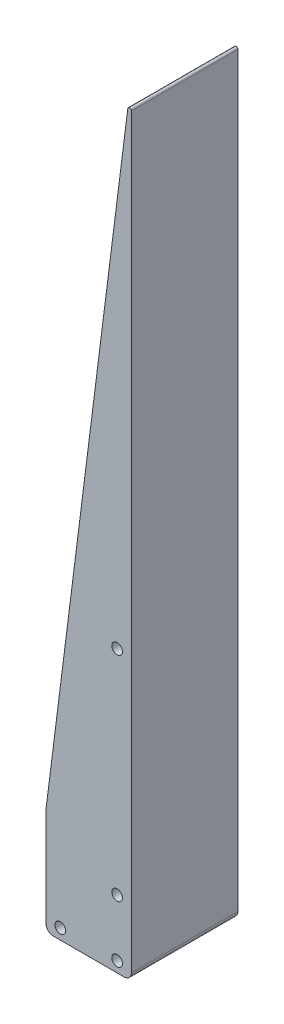
ISO-10303-21;
HEADER;
FILE_DESCRIPTION(('STEP AP214'),'2;1');
FILE_NAME('part.step','',(''),(''),'','','');
FILE_SCHEMA(('AUTOMOTIVE_DESIGN { 1 0 10303 214 1 1 1 1 }'));
ENDSEC;
DATA;
#1=APPLICATION_CONTEXT('core data for automotive mechanical design processes');
#2=APPLICATION_PROTOCOL_DEFINITION('international standard','automotive_design',2000,#1);
#3=PRODUCT_CONTEXT('',#1,'mechanical');
#4=PRODUCT('Part','Part','',(#3));
#5=PRODUCT_RELATED_PRODUCT_CATEGORY('part','',(#4));
#6=PRODUCT_DEFINITION_FORMATION('','',#4);
#7=PRODUCT_DEFINITION_CONTEXT('part definition',#1,'design');
#8=PRODUCT_DEFINITION('design','',#6,#7);
#9=PRODUCT_DEFINITION_SHAPE('','',#8);
#10=(LENGTH_UNIT() NAMED_UNIT(*) SI_UNIT(.MILLI.,.METRE.));
#11=(NAMED_UNIT(*) PLANE_ANGLE_UNIT() SI_UNIT($,.RADIAN.));
#12=(NAMED_UNIT(*) SI_UNIT($,.STERADIAN.) SOLID_ANGLE_UNIT());
#13=UNCERTAINTY_MEASURE_WITH_UNIT(LENGTH_MEASURE(1.E-05),#10,'distance_accuracy_value','');
#14=(GEOMETRIC_REPRESENTATION_CONTEXT(3) GLOBAL_UNCERTAINTY_ASSIGNED_CONTEXT((#13)) GLOBAL_UNIT_ASSIGNED_CONTEXT((#10,
#11,#12)) REPRESENTATION_CONTEXT('',''));
#15=CARTESIAN_POINT('',(0.,0.,0.));
#16=DIRECTION('',(0.,0.,1.));
#17=DIRECTION('',(1.,0.,0.));
#18=AXIS2_PLACEMENT_3D('',#15,#16,#17);
#19=CARTESIAN_POINT('',(23.5,212.051879356824,30.));
#20=DIRECTION('',(0.,0.,1.));
#21=DIRECTION('',(1.,0.,0.));
#22=AXIS2_PLACEMENT_3D('',#19,#20,#21);
#23=PLANE('',#22);
#24=CARTESIAN_POINT('',(19.9999999999995,79.0000000000001,30.));
#25=DIRECTION('',(0.,0.,-1.));
#26=DIRECTION('',(-1.,0.,0.));
#27=AXIS2_PLACEMENT_3D('',#24,#25,#26);
#28=CIRCLE('',#27,1.5);
#29=CARTESIAN_POINT('',(18.4999999999994,79.0000000000001,30.));
#30=VERTEX_POINT('',#29);
#31=EDGE_CURVE('E205',#30,#30,#28,.T.);
#32=ORIENTED_EDGE('',*,*,#31,.T.);
#33=EDGE_LOOP('',(#32));
#34=FACE_BOUND('',#33,.T.);
#35=CARTESIAN_POINT('',(4.,2.99999999999989,30.));
#36=DIRECTION('',(0.,0.,1.));
#37=DIRECTION('',(1.,0.,0.));
#38=AXIS2_PLACEMENT_3D('',#35,#36,#37);
#39=CIRCLE('',#38,1.5);
#40=CARTESIAN_POINT('',(5.5,2.99999999999989,30.));
#41=VERTEX_POINT('',#40);
#42=EDGE_CURVE('E186',#41,#41,#39,.T.);
#43=ORIENTED_EDGE('',*,*,#42,.F.);
#44=EDGE_LOOP('',(#43));
#45=FACE_BOUND('',#44,.T.);
#46=CARTESIAN_POINT('',(23.5,212.051879356824,30.));
#47=DIRECTION('',(0.,0.,1.));
#48=DIRECTION('',(1.,0.,0.));
#49=AXIS2_PLACEMENT_3D('',#46,#47,#48);
#50=CIRCLE('',#49,0.5);
#51=CARTESIAN_POINT('',(24.,212.051879356824,30.));
#52=VERTEX_POINT('',#51);
#53=CARTESIAN_POINT('',(23.0039418111876,212.114539338569,30.));
#54=VERTEX_POINT('',#53);
#55=EDGE_CURVE('E153',#52,#54,#50,.T.);
#56=ORIENTED_EDGE('',*,*,#55,.T.);
#57=DIRECTION('',(-0.125319963489427,-0.992116377624626,0.));
#58=VECTOR('',#57,1.);
#59=CARTESIAN_POINT('',(23.0039418111876,212.114539338569,30.));
#60=LINE('',#59,#58);
#61=CARTESIAN_POINT('',(0.0157672447507946,30.1248240209441,30.));
#62=VERTEX_POINT('',#61);
#63=EDGE_CURVE('E101',#54,#62,#60,.T.);
#64=ORIENTED_EDGE('',*,*,#63,.T.);
#65=CARTESIAN_POINT('',(2.00000000000004,29.8741840939652,30.));
#66=DIRECTION('',(0.,0.,1.));
#67=DIRECTION('',(-1.,0.,0.));
#68=AXIS2_PLACEMENT_3D('',#65,#66,#67);
#69=CIRCLE('',#68,2.);
#70=CARTESIAN_POINT('',(0.,29.8741840939652,30.));
#71=VERTEX_POINT('',#70);
#72=EDGE_CURVE('E169',#62,#71,#69,.T.);
#73=ORIENTED_EDGE('',*,*,#72,.T.);
#74=DIRECTION('',(0.,-1.,0.));
#75=VECTOR('',#74,1.);
#76=CARTESIAN_POINT('',(0.,2.00000000000002,30.));
#77=LINE('',#76,#75);
#78=CARTESIAN_POINT('',(0.,2.,30.));
#79=VERTEX_POINT('',#78);
#80=EDGE_CURVE('E182',#71,#79,#77,.T.);
#81=ORIENTED_EDGE('',*,*,#80,.T.);
#82=CARTESIAN_POINT('',(2.,2.,30.));
#83=DIRECTION('',(0.,0.,1.));
#84=DIRECTION('',(-1.,0.,0.));
#85=AXIS2_PLACEMENT_3D('',#82,#83,#84);
#86=CIRCLE('',#85,2.);
#87=CARTESIAN_POINT('',(2.00000000000002,0.,30.));
#88=VERTEX_POINT('',#87);
#89=EDGE_CURVE('E116',#79,#88,#86,.T.);
#90=ORIENTED_EDGE('',*,*,#89,.T.);
#91=DIRECTION('',(1.,0.,0.));
#92=VECTOR('',#91,1.);
#93=CARTESIAN_POINT('',(2.00000000000002,0.,30.));
#94=LINE('',#93,#92);
#95=CARTESIAN_POINT('',(22.,0.,30.));
#96=VERTEX_POINT('',#95);
#97=EDGE_CURVE('E111',#88,#96,#94,.T.);
#98=ORIENTED_EDGE('',*,*,#97,.T.);
#99=CARTESIAN_POINT('',(22.,2.,30.));
#100=DIRECTION('',(0.,0.,1.));
#101=DIRECTION('',(-1.,0.,0.));
#102=AXIS2_PLACEMENT_3D('',#99,#100,#101);
#103=CIRCLE('',#102,2.);
#104=CARTESIAN_POINT('',(24.,2.00000000000001,30.));
#105=VERTEX_POINT('',#104);
#106=EDGE_CURVE('E117',#96,#105,#103,.T.);
#107=ORIENTED_EDGE('',*,*,#106,.T.);
#108=DIRECTION('',(0.,1.,0.));
#109=VECTOR('',#108,1.);
#110=CARTESIAN_POINT('',(24.,2.00000000000001,30.));
#111=LINE('',#110,#109);
#112=EDGE_CURVE('E59',#105,#52,#111,.T.);
#113=ORIENTED_EDGE('',*,*,#112,.T.);
#114=EDGE_LOOP('',(#56,#64,#73,#81,#90,#98,#107,#113));
#115=FACE_BOUND('',#114,.T.);
#116=CARTESIAN_POINT('',(20.,3.,30.));
#117=DIRECTION('',(0.,0.,1.));
#118=DIRECTION('',(1.,0.,0.));
#119=AXIS2_PLACEMENT_3D('',#116,#117,#118);
#120=CIRCLE('',#119,1.5);
#121=CARTESIAN_POINT('',(21.5,3.,30.));
#122=VERTEX_POINT('',#121);
#123=EDGE_CURVE('E142',#122,#122,#120,.T.);
#124=ORIENTED_EDGE('',*,*,#123,.F.);
#125=EDGE_LOOP('',(#124));
#126=FACE_BOUND('',#125,.T.);
#127=CARTESIAN_POINT('',(19.9999999999999,19.,30.));
#128=DIRECTION('',(0.,0.,1.));
#129=DIRECTION('',(1.,0.,0.));
#130=AXIS2_PLACEMENT_3D('',#127,#128,#129);
#131=CIRCLE('',#130,1.5);
#132=CARTESIAN_POINT('',(21.4999999999999,19.,30.));
#133=VERTEX_POINT('',#132);
#134=EDGE_CURVE('E198',#133,#133,#131,.T.);
#135=ORIENTED_EDGE('',*,*,#134,.F.);
#136=EDGE_LOOP('',(#135));
#137=FACE_BOUND('',#136,.T.);
#138=ADVANCED_FACE('F41',(#34,#45,#115,#126,#137),#23,.T.);
#139=CARTESIAN_POINT('',(23.5,212.051879356824,0.));
#140=DIRECTION('',(0.,0.,1.));
#141=DIRECTION('',(1.,0.,0.));
#142=AXIS2_PLACEMENT_3D('',#139,#140,#141);
#143=PLANE('',#142);
#144=CARTESIAN_POINT('',(19.9999999999995,79.0000000000001,0.));
#145=DIRECTION('',(0.,0.,-1.));
#146=DIRECTION('',(-1.,0.,0.));
#147=AXIS2_PLACEMENT_3D('',#144,#145,#146);
#148=CIRCLE('',#147,1.5);
#149=CARTESIAN_POINT('',(18.4999999999994,79.0000000000001,0.));
#150=VERTEX_POINT('',#149);
#151=EDGE_CURVE('E202',#150,#150,#148,.T.);
#152=ORIENTED_EDGE('',*,*,#151,.F.);
#153=EDGE_LOOP('',(#152));
#154=FACE_BOUND('',#153,.T.);
#155=CARTESIAN_POINT('',(23.5,212.051879356824,0.));
#156=DIRECTION('',(0.,0.,1.));
#157=DIRECTION('',(1.,0.,0.));
#158=AXIS2_PLACEMENT_3D('',#155,#156,#157);
#159=CIRCLE('',#158,0.5);
#160=CARTESIAN_POINT('',(24.,212.051879356824,0.));
#161=VERTEX_POINT('',#160);
#162=CARTESIAN_POINT('',(23.0039418111876,212.114539338569,0.));
#163=VERTEX_POINT('',#162);
#164=EDGE_CURVE('E137',#161,#163,#159,.T.);
#165=ORIENTED_EDGE('',*,*,#164,.F.);
#166=DIRECTION('',(0.,1.,0.));
#167=VECTOR('',#166,1.);
#168=CARTESIAN_POINT('',(24.,2.00000000000001,0.));
#169=LINE('',#168,#167);
#170=CARTESIAN_POINT('',(24.,2.00000000000001,0.));
#171=VERTEX_POINT('',#170);
#172=EDGE_CURVE('E91',#171,#161,#169,.T.);
#173=ORIENTED_EDGE('',*,*,#172,.F.);
#174=CARTESIAN_POINT('',(22.,2.,0.));
#175=DIRECTION('',(0.,0.,1.));
#176=DIRECTION('',(-1.,0.,0.));
#177=AXIS2_PLACEMENT_3D('',#174,#175,#176);
#178=CIRCLE('',#177,2.);
#179=CARTESIAN_POINT('',(22.,0.,0.));
#180=VERTEX_POINT('',#179);
#181=EDGE_CURVE('E87',#180,#171,#178,.T.);
#182=ORIENTED_EDGE('',*,*,#181,.F.);
#183=DIRECTION('',(1.,0.,0.));
#184=VECTOR('',#183,1.);
#185=CARTESIAN_POINT('',(2.00000000000002,0.,0.));
#186=LINE('',#185,#184);
#187=CARTESIAN_POINT('',(2.00000000000002,0.,0.));
#188=VERTEX_POINT('',#187);
#189=EDGE_CURVE('E126',#188,#180,#186,.T.);
#190=ORIENTED_EDGE('',*,*,#189,.F.);
#191=CARTESIAN_POINT('',(2.,2.,0.));
#192=DIRECTION('',(0.,0.,1.));
#193=DIRECTION('',(-1.,0.,0.));
#194=AXIS2_PLACEMENT_3D('',#191,#192,#193);
#195=CIRCLE('',#194,2.);
#196=CARTESIAN_POINT('',(0.,2.,0.));
#197=VERTEX_POINT('',#196);
#198=EDGE_CURVE('E146',#197,#188,#195,.T.);
#199=ORIENTED_EDGE('',*,*,#198,.F.);
#200=DIRECTION('',(0.,-1.,0.));
#201=VECTOR('',#200,1.);
#202=CARTESIAN_POINT('',(0.,2.00000000000002,0.));
#203=LINE('',#202,#201);
#204=CARTESIAN_POINT('',(0.,29.8741840939652,0.));
#205=VERTEX_POINT('',#204);
#206=EDGE_CURVE('E148',#205,#197,#203,.T.);
#207=ORIENTED_EDGE('',*,*,#206,.F.);
#208=CARTESIAN_POINT('',(2.00000000000004,29.8741840939652,0.));
#209=DIRECTION('',(0.,0.,1.));
#210=DIRECTION('',(-1.,0.,0.));
#211=AXIS2_PLACEMENT_3D('',#208,#209,#210);
#212=CIRCLE('',#211,2.);
#213=CARTESIAN_POINT('',(0.0157672447507946,30.1248240209441,0.));
#214=VERTEX_POINT('',#213);
#215=EDGE_CURVE('E145',#214,#205,#212,.T.);
#216=ORIENTED_EDGE('',*,*,#215,.F.);
#217=DIRECTION('',(-0.125319963489427,-0.992116377624626,0.));
#218=VECTOR('',#217,1.);
#219=CARTESIAN_POINT('',(23.0039418111876,212.114539338569,0.));
#220=LINE('',#219,#218);
#221=EDGE_CURVE('E143',#163,#214,#220,.T.);
#222=ORIENTED_EDGE('',*,*,#221,.F.);
#223=EDGE_LOOP('',(#165,#173,#182,#190,#199,#207,#216,#222));
#224=FACE_BOUND('',#223,.T.);
#225=CARTESIAN_POINT('',(20.,3.,0.));
#226=DIRECTION('',(0.,0.,1.));
#227=DIRECTION('',(1.,0.,0.));
#228=AXIS2_PLACEMENT_3D('',#225,#226,#227);
#229=CIRCLE('',#228,1.5);
#230=CARTESIAN_POINT('',(21.5,3.,0.));
#231=VERTEX_POINT('',#230);
#232=EDGE_CURVE('E189',#231,#231,#229,.T.);
#233=ORIENTED_EDGE('',*,*,#232,.T.);
#234=EDGE_LOOP('',(#233));
#235=FACE_BOUND('',#234,.T.);
#236=CARTESIAN_POINT('',(4.,2.99999999999989,0.));
#237=DIRECTION('',(0.,0.,1.));
#238=DIRECTION('',(1.,0.,0.));
#239=AXIS2_PLACEMENT_3D('',#236,#237,#238);
#240=CIRCLE('',#239,1.5);
#241=CARTESIAN_POINT('',(5.5,2.99999999999989,0.));
#242=VERTEX_POINT('',#241);
#243=EDGE_CURVE('E192',#242,#242,#240,.T.);
#244=ORIENTED_EDGE('',*,*,#243,.T.);
#245=EDGE_LOOP('',(#244));
#246=FACE_BOUND('',#245,.T.);
#247=CARTESIAN_POINT('',(19.9999999999999,19.,0.));
#248=DIRECTION('',(0.,0.,1.));
#249=DIRECTION('',(1.,0.,0.));
#250=AXIS2_PLACEMENT_3D('',#247,#248,#249);
#251=CIRCLE('',#250,1.5);
#252=CARTESIAN_POINT('',(21.4999999999999,19.,0.));
#253=VERTEX_POINT('',#252);
#254=EDGE_CURVE('E200',#253,#253,#251,.T.);
#255=ORIENTED_EDGE('',*,*,#254,.T.);
#256=EDGE_LOOP('',(#255));
#257=FACE_BOUND('',#256,.T.);
#258=ADVANCED_FACE('F174',(#154,#224,#235,#246,#257),#143,.F.);
#259=CARTESIAN_POINT('',(23.5,212.051879356824,30.));
#260=DIRECTION('',(0.,0.,-1.));
#261=DIRECTION('',(-1.,0.,0.));
#262=AXIS2_PLACEMENT_3D('',#259,#260,#261);
#263=CYLINDRICAL_SURFACE('',#262,0.5);
#264=ORIENTED_EDGE('',*,*,#164,.T.);
#265=DIRECTION('',(0.,0.,-1.));
#266=VECTOR('',#265,1.);
#267=CARTESIAN_POINT('',(23.0039418111876,212.114539338569,30.));
#268=LINE('',#267,#266);
#269=EDGE_CURVE('E11',#54,#163,#268,.T.);
#270=ORIENTED_EDGE('',*,*,#269,.F.);
#271=ORIENTED_EDGE('',*,*,#55,.F.);
#272=DIRECTION('',(0.,0.,-1.));
#273=VECTOR('',#272,1.);
#274=CARTESIAN_POINT('',(24.,212.051879356824,30.));
#275=LINE('',#274,#273);
#276=EDGE_CURVE('E135',#52,#161,#275,.T.);
#277=ORIENTED_EDGE('',*,*,#276,.T.);
#278=EDGE_LOOP('',(#264,#270,#271,#277));
#279=FACE_BOUND('',#278,.T.);
#280=ADVANCED_FACE('F43',(#279),#263,.T.);
#281=CARTESIAN_POINT('',(23.0039418111876,212.114539338569,30.));
#282=DIRECTION('',(0.992116377624626,-0.125319963489427,0.));
#283=DIRECTION('',(0.125319963489427,0.992116377624626,0.));
#284=AXIS2_PLACEMENT_3D('',#281,#282,#283);
#285=PLANE('',#284);
#286=ORIENTED_EDGE('',*,*,#221,.T.);
#287=DIRECTION('',(0.,0.,-1.));
#288=VECTOR('',#287,1.);
#289=CARTESIAN_POINT('',(0.0157672447507946,30.1248240209441,30.));
#290=LINE('',#289,#288);
#291=EDGE_CURVE('E49',#62,#214,#290,.T.);
#292=ORIENTED_EDGE('',*,*,#291,.F.);
#293=ORIENTED_EDGE('',*,*,#63,.F.);
#294=ORIENTED_EDGE('',*,*,#269,.T.);
#295=EDGE_LOOP('',(#286,#292,#293,#294));
#296=FACE_BOUND('',#295,.T.);
#297=ADVANCED_FACE('F228',(#296),#285,.F.);
#298=CARTESIAN_POINT('',(2.00000000000004,29.8741840939652,30.));
#299=DIRECTION('',(0.,0.,-1.));
#300=DIRECTION('',(-1.,0.,0.));
#301=AXIS2_PLACEMENT_3D('',#298,#299,#300);
#302=CYLINDRICAL_SURFACE('',#301,2.);
#303=ORIENTED_EDGE('',*,*,#215,.T.);
#304=DIRECTION('',(0.,0.,-1.));
#305=VECTOR('',#304,1.);
#306=CARTESIAN_POINT('',(0.,29.8741840939652,30.));
#307=LINE('',#306,#305);
#308=EDGE_CURVE('E159',#71,#205,#307,.T.);
#309=ORIENTED_EDGE('',*,*,#308,.F.);
#310=ORIENTED_EDGE('',*,*,#72,.F.);
#311=ORIENTED_EDGE('',*,*,#291,.T.);
#312=EDGE_LOOP('',(#303,#309,#310,#311));
#313=FACE_BOUND('',#312,.T.);
#314=ADVANCED_FACE('F167',(#313),#302,.T.);
#315=CARTESIAN_POINT('',(0.,2.00000000000002,30.));
#316=DIRECTION('',(1.,0.,0.));
#317=DIRECTION('',(0.,1.,0.));
#318=AXIS2_PLACEMENT_3D('',#315,#316,#317);
#319=PLANE('',#318);
#320=ORIENTED_EDGE('',*,*,#206,.T.);
#321=DIRECTION('',(0.,0.,-1.));
#322=VECTOR('',#321,1.);
#323=CARTESIAN_POINT('',(0.,2.,30.));
#324=LINE('',#323,#322);
#325=EDGE_CURVE('E160',#79,#197,#324,.T.);
#326=ORIENTED_EDGE('',*,*,#325,.F.);
#327=ORIENTED_EDGE('',*,*,#80,.F.);
#328=ORIENTED_EDGE('',*,*,#308,.T.);
#329=EDGE_LOOP('',(#320,#326,#327,#328));
#330=FACE_BOUND('',#329,.T.);
#331=ADVANCED_FACE('F180',(#330),#319,.F.);
#332=CARTESIAN_POINT('',(2.,2.,30.));
#333=DIRECTION('',(0.,0.,-1.));
#334=DIRECTION('',(-1.,0.,0.));
#335=AXIS2_PLACEMENT_3D('',#332,#333,#334);
#336=CYLINDRICAL_SURFACE('',#335,2.);
#337=ORIENTED_EDGE('',*,*,#198,.T.);
#338=DIRECTION('',(0.,0.,-1.));
#339=VECTOR('',#338,1.);
#340=CARTESIAN_POINT('',(2.00000000000002,0.,30.));
#341=LINE('',#340,#339);
#342=EDGE_CURVE('E129',#88,#188,#341,.T.);
#343=ORIENTED_EDGE('',*,*,#342,.F.);
#344=ORIENTED_EDGE('',*,*,#89,.F.);
#345=ORIENTED_EDGE('',*,*,#325,.T.);
#346=EDGE_LOOP('',(#337,#343,#344,#345));
#347=FACE_BOUND('',#346,.T.);
#348=ADVANCED_FACE('F179',(#347),#336,.T.);
#349=CARTESIAN_POINT('',(2.00000000000002,0.,30.));
#350=DIRECTION('',(0.,1.,0.));
#351=DIRECTION('',(0.,0.,1.));
#352=AXIS2_PLACEMENT_3D('',#349,#350,#351);
#353=PLANE('',#352);
#354=ORIENTED_EDGE('',*,*,#189,.T.);
#355=DIRECTION('',(0.,0.,-1.));
#356=VECTOR('',#355,1.);
#357=CARTESIAN_POINT('',(22.,0.,30.));
#358=LINE('',#357,#356);
#359=EDGE_CURVE('E124',#96,#180,#358,.T.);
#360=ORIENTED_EDGE('',*,*,#359,.F.);
#361=ORIENTED_EDGE('',*,*,#97,.F.);
#362=ORIENTED_EDGE('',*,*,#342,.T.);
#363=EDGE_LOOP('',(#354,#360,#361,#362));
#364=FACE_BOUND('',#363,.T.);
#365=ADVANCED_FACE('F127',(#364),#353,.F.);
#366=CARTESIAN_POINT('',(22.,2.,30.));
#367=DIRECTION('',(0.,0.,-1.));
#368=DIRECTION('',(-1.,0.,0.));
#369=AXIS2_PLACEMENT_3D('',#366,#367,#368);
#370=CYLINDRICAL_SURFACE('',#369,2.);
#371=ORIENTED_EDGE('',*,*,#181,.T.);
#372=DIRECTION('',(0.,0.,-1.));
#373=VECTOR('',#372,1.);
#374=CARTESIAN_POINT('',(24.,2.00000000000001,30.));
#375=LINE('',#374,#373);
#376=EDGE_CURVE('E128',#105,#171,#375,.T.);
#377=ORIENTED_EDGE('',*,*,#376,.F.);
#378=ORIENTED_EDGE('',*,*,#106,.F.);
#379=ORIENTED_EDGE('',*,*,#359,.T.);
#380=EDGE_LOOP('',(#371,#377,#378,#379));
#381=FACE_BOUND('',#380,.T.);
#382=ADVANCED_FACE('F134',(#381),#370,.T.);
#383=CARTESIAN_POINT('',(24.,2.00000000000001,30.));
#384=DIRECTION('',(-1.,0.,0.));
#385=DIRECTION('',(0.,0.,1.));
#386=AXIS2_PLACEMENT_3D('',#383,#384,#385);
#387=PLANE('',#386);
#388=ORIENTED_EDGE('',*,*,#172,.T.);
#389=ORIENTED_EDGE('',*,*,#276,.F.);
#390=ORIENTED_EDGE('',*,*,#112,.F.);
#391=ORIENTED_EDGE('',*,*,#376,.T.);
#392=EDGE_LOOP('',(#388,#389,#390,#391));
#393=FACE_BOUND('',#392,.T.);
#394=ADVANCED_FACE('F231',(#393),#387,.F.);
#395=CARTESIAN_POINT('',(20.,3.,30.));
#396=DIRECTION('',(0.,0.,-1.));
#397=DIRECTION('',(-1.,0.,0.));
#398=AXIS2_PLACEMENT_3D('',#395,#396,#397);
#399=CYLINDRICAL_SURFACE('',#398,1.5);
#400=ORIENTED_EDGE('',*,*,#123,.T.);
#401=EDGE_LOOP('',(#400));
#402=FACE_BOUND('',#401,.T.);
#403=ORIENTED_EDGE('',*,*,#232,.F.);
#404=EDGE_LOOP('',(#403));
#405=FACE_BOUND('',#404,.T.);
#406=ADVANCED_FACE('F233',(#402,#405),#399,.F.);
#407=CARTESIAN_POINT('',(4.,2.99999999999989,30.));
#408=DIRECTION('',(0.,0.,-1.));
#409=DIRECTION('',(-1.,0.,0.));
#410=AXIS2_PLACEMENT_3D('',#407,#408,#409);
#411=CYLINDRICAL_SURFACE('',#410,1.5);
#412=ORIENTED_EDGE('',*,*,#42,.T.);
#413=EDGE_LOOP('',(#412));
#414=FACE_BOUND('',#413,.T.);
#415=ORIENTED_EDGE('',*,*,#243,.F.);
#416=EDGE_LOOP('',(#415));
#417=FACE_BOUND('',#416,.T.);
#418=ADVANCED_FACE('F287',(#414,#417),#411,.F.);
#419=CARTESIAN_POINT('',(19.9999999999999,19.,30.));
#420=DIRECTION('',(0.,0.,-1.));
#421=DIRECTION('',(-1.,0.,0.));
#422=AXIS2_PLACEMENT_3D('',#419,#420,#421);
#423=CYLINDRICAL_SURFACE('',#422,1.5);
#424=ORIENTED_EDGE('',*,*,#134,.T.);
#425=EDGE_LOOP('',(#424));
#426=FACE_BOUND('',#425,.T.);
#427=ORIENTED_EDGE('',*,*,#254,.F.);
#428=EDGE_LOOP('',(#427));
#429=FACE_BOUND('',#428,.T.);
#430=ADVANCED_FACE('F216',(#426,#429),#423,.F.);
#431=CARTESIAN_POINT('',(19.9999999999995,79.0000000000001,30.));
#432=DIRECTION('',(0.,0.,-1.));
#433=DIRECTION('',(-1.,0.,0.));
#434=AXIS2_PLACEMENT_3D('',#431,#432,#433);
#435=CYLINDRICAL_SURFACE('',#434,1.5);
#436=ORIENTED_EDGE('',*,*,#31,.F.);
#437=EDGE_LOOP('',(#436));
#438=FACE_BOUND('',#437,.T.);
#439=ORIENTED_EDGE('',*,*,#151,.T.);
#440=EDGE_LOOP('',(#439));
#441=FACE_BOUND('',#440,.T.);
#442=ADVANCED_FACE('F213',(#438,#441),#435,.F.);
#443=CLOSED_SHELL('',(#138,#258,#280,#297,#314,#331,#348,#365,#382,#394,#406,#418,#430,#442));
#444=MANIFOLD_SOLID_BREP('B2',#443);
#445=ADVANCED_BREP_SHAPE_REPRESENTATION('',(#18,#444),#14);
#446=SHAPE_DEFINITION_REPRESENTATION(#9,#445);
ENDSEC;
END-ISO-10303-21;
